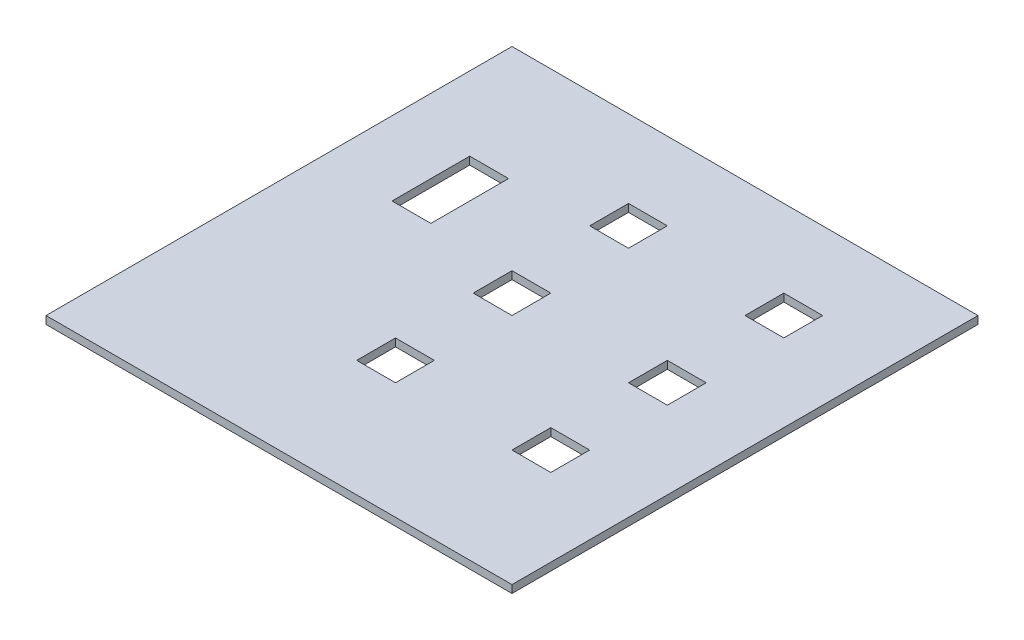
ISO-10303-21;
HEADER;
FILE_DESCRIPTION(('STEP AP214'),'2;1');
FILE_NAME('part.step','',(''),(''),'','','');
FILE_SCHEMA(('AUTOMOTIVE_DESIGN { 1 0 10303 214 1 1 1 1 }'));
ENDSEC;
DATA;
#1=APPLICATION_CONTEXT('core data for automotive mechanical design processes');
#2=APPLICATION_PROTOCOL_DEFINITION('international standard','automotive_design',2000,#1);
#3=PRODUCT_CONTEXT('',#1,'mechanical');
#4=PRODUCT('Part','Part','',(#3));
#5=PRODUCT_RELATED_PRODUCT_CATEGORY('part','',(#4));
#6=PRODUCT_DEFINITION_FORMATION('','',#4);
#7=PRODUCT_DEFINITION_CONTEXT('part definition',#1,'design');
#8=PRODUCT_DEFINITION('design','',#6,#7);
#9=PRODUCT_DEFINITION_SHAPE('','',#8);
#10=(LENGTH_UNIT() NAMED_UNIT(*) SI_UNIT(.MILLI.,.METRE.));
#11=(NAMED_UNIT(*) PLANE_ANGLE_UNIT() SI_UNIT($,.RADIAN.));
#12=(NAMED_UNIT(*) SI_UNIT($,.STERADIAN.) SOLID_ANGLE_UNIT());
#13=UNCERTAINTY_MEASURE_WITH_UNIT(LENGTH_MEASURE(1.E-05),#10,'distance_accuracy_value','');
#14=(GEOMETRIC_REPRESENTATION_CONTEXT(3) GLOBAL_UNCERTAINTY_ASSIGNED_CONTEXT((#13)) GLOBAL_UNIT_ASSIGNED_CONTEXT((#10,
#11,#12)) REPRESENTATION_CONTEXT('',''));
#15=CARTESIAN_POINT('',(0.,0.,0.));
#16=DIRECTION('',(0.,0.,1.));
#17=DIRECTION('',(1.,0.,0.));
#18=AXIS2_PLACEMENT_3D('',#15,#16,#17);
#19=CARTESIAN_POINT('',(76.2,0.,50.8));
#20=DIRECTION('',(0.,0.,-1.));
#21=DIRECTION('',(-1.,0.,0.));
#22=AXIS2_PLACEMENT_3D('',#19,#20,#21);
#23=PLANE('',#22);
#24=DIRECTION('',(-1.,0.,0.));
#25=VECTOR('',#24,1.);
#26=CARTESIAN_POINT('',(76.2,5.08,50.8));
#27=LINE('',#26,#25);
#28=CARTESIAN_POINT('',(101.6,5.08,50.8));
#29=VERTEX_POINT('',#28);
#30=CARTESIAN_POINT('',(76.2,5.08,50.8));
#31=VERTEX_POINT('',#30);
#32=EDGE_CURVE('E554',#29,#31,#27,.T.);
#33=ORIENTED_EDGE('',*,*,#32,.T.);
#34=DIRECTION('',(0.,1.,0.));
#35=VECTOR('',#34,1.);
#36=CARTESIAN_POINT('',(76.2,0.,50.8));
#37=LINE('',#36,#35);
#38=CARTESIAN_POINT('',(76.2,0.,50.8));
#39=VERTEX_POINT('',#38);
#40=EDGE_CURVE('E583',#39,#31,#37,.T.);
#41=ORIENTED_EDGE('',*,*,#40,.F.);
#42=DIRECTION('',(-1.,0.,0.));
#43=VECTOR('',#42,1.);
#44=CARTESIAN_POINT('',(76.2,0.,50.8));
#45=LINE('',#44,#43);
#46=CARTESIAN_POINT('',(101.6,0.,50.8));
#47=VERTEX_POINT('',#46);
#48=EDGE_CURVE('E561',#47,#39,#45,.T.);
#49=ORIENTED_EDGE('',*,*,#48,.F.);
#50=DIRECTION('',(0.,1.,0.));
#51=VECTOR('',#50,1.);
#52=CARTESIAN_POINT('',(101.6,0.,50.8));
#53=LINE('',#52,#51);
#54=EDGE_CURVE('E571',#47,#29,#53,.T.);
#55=ORIENTED_EDGE('',*,*,#54,.T.);
#56=EDGE_LOOP('',(#33,#41,#49,#55));
#57=FACE_BOUND('',#56,.T.);
#58=ADVANCED_FACE('F38',(#57),#23,.F.);
#59=CARTESIAN_POINT('',(76.2,0.,76.2));
#60=DIRECTION('',(-1.,0.,0.));
#61=DIRECTION('',(0.,0.,1.));
#62=AXIS2_PLACEMENT_3D('',#59,#60,#61);
#63=PLANE('',#62);
#64=DIRECTION('',(0.,0.,1.));
#65=VECTOR('',#64,1.);
#66=CARTESIAN_POINT('',(76.2,5.08,76.2));
#67=LINE('',#66,#65);
#68=CARTESIAN_POINT('',(76.2,5.08,76.2));
#69=VERTEX_POINT('',#68);
#70=EDGE_CURVE('E550',#31,#69,#67,.T.);
#71=ORIENTED_EDGE('',*,*,#70,.T.);
#72=DIRECTION('',(0.,1.,0.));
#73=VECTOR('',#72,1.);
#74=CARTESIAN_POINT('',(76.2,0.,76.2));
#75=LINE('',#74,#73);
#76=CARTESIAN_POINT('',(76.2,0.,76.2));
#77=VERTEX_POINT('',#76);
#78=EDGE_CURVE('E579',#77,#69,#75,.T.);
#79=ORIENTED_EDGE('',*,*,#78,.F.);
#80=DIRECTION('',(0.,0.,1.));
#81=VECTOR('',#80,1.);
#82=CARTESIAN_POINT('',(76.2,0.,76.2));
#83=LINE('',#82,#81);
#84=EDGE_CURVE('E564',#39,#77,#83,.T.);
#85=ORIENTED_EDGE('',*,*,#84,.F.);
#86=ORIENTED_EDGE('',*,*,#40,.T.);
#87=EDGE_LOOP('',(#71,#79,#85,#86));
#88=FACE_BOUND('',#87,.T.);
#89=ADVANCED_FACE('F615',(#88),#63,.F.);
#90=CARTESIAN_POINT('',(76.2,0.,76.2));
#91=DIRECTION('',(0.,0.,1.));
#92=DIRECTION('',(1.,0.,0.));
#93=AXIS2_PLACEMENT_3D('',#90,#91,#92);
#94=PLANE('',#93);
#95=DIRECTION('',(1.,0.,0.));
#96=VECTOR('',#95,1.);
#97=CARTESIAN_POINT('',(76.2,5.08,76.2));
#98=LINE('',#97,#96);
#99=CARTESIAN_POINT('',(101.6,5.08,76.2));
#100=VERTEX_POINT('',#99);
#101=EDGE_CURVE('E546',#69,#100,#98,.T.);
#102=ORIENTED_EDGE('',*,*,#101,.T.);
#103=DIRECTION('',(0.,1.,0.));
#104=VECTOR('',#103,1.);
#105=CARTESIAN_POINT('',(101.6,0.,76.2));
#106=LINE('',#105,#104);
#107=CARTESIAN_POINT('',(101.6,0.,76.2));
#108=VERTEX_POINT('',#107);
#109=EDGE_CURVE('E575',#108,#100,#106,.T.);
#110=ORIENTED_EDGE('',*,*,#109,.F.);
#111=DIRECTION('',(1.,0.,0.));
#112=VECTOR('',#111,1.);
#113=CARTESIAN_POINT('',(76.2,0.,76.2));
#114=LINE('',#113,#112);
#115=EDGE_CURVE('E567',#77,#108,#114,.T.);
#116=ORIENTED_EDGE('',*,*,#115,.F.);
#117=ORIENTED_EDGE('',*,*,#78,.T.);
#118=EDGE_LOOP('',(#102,#110,#116,#117));
#119=FACE_BOUND('',#118,.T.);
#120=ADVANCED_FACE('F621',(#119),#94,.F.);
#121=CARTESIAN_POINT('',(101.6,0.,76.2));
#122=DIRECTION('',(1.,0.,0.));
#123=DIRECTION('',(0.,0.,-1.));
#124=AXIS2_PLACEMENT_3D('',#121,#122,#123);
#125=PLANE('',#124);
#126=DIRECTION('',(0.,0.,-1.));
#127=VECTOR('',#126,1.);
#128=CARTESIAN_POINT('',(101.6,5.08,76.2));
#129=LINE('',#128,#127);
#130=EDGE_CURVE('E543',#100,#29,#129,.T.);
#131=ORIENTED_EDGE('',*,*,#130,.T.);
#132=ORIENTED_EDGE('',*,*,#54,.F.);
#133=DIRECTION('',(0.,0.,-1.));
#134=VECTOR('',#133,1.);
#135=CARTESIAN_POINT('',(101.6,0.,76.2));
#136=LINE('',#135,#134);
#137=EDGE_CURVE('E558',#108,#47,#136,.T.);
#138=ORIENTED_EDGE('',*,*,#137,.F.);
#139=ORIENTED_EDGE('',*,*,#109,.T.);
#140=EDGE_LOOP('',(#131,#132,#138,#139));
#141=FACE_BOUND('',#140,.T.);
#142=ADVANCED_FACE('F635',(#141),#125,.F.);
#143=CARTESIAN_POINT('',(76.2,0.,-25.4));
#144=DIRECTION('',(0.,0.,-1.));
#145=DIRECTION('',(-1.,0.,0.));
#146=AXIS2_PLACEMENT_3D('',#143,#144,#145);
#147=PLANE('',#146);
#148=DIRECTION('',(-1.,0.,0.));
#149=VECTOR('',#148,1.);
#150=CARTESIAN_POINT('',(76.2,5.08,-25.4));
#151=LINE('',#150,#149);
#152=CARTESIAN_POINT('',(101.6,5.08,-25.4));
#153=VERTEX_POINT('',#152);
#154=CARTESIAN_POINT('',(76.2,5.08,-25.4));
#155=VERTEX_POINT('',#154);
#156=EDGE_CURVE('E510',#153,#155,#151,.T.);
#157=ORIENTED_EDGE('',*,*,#156,.T.);
#158=DIRECTION('',(0.,1.,0.));
#159=VECTOR('',#158,1.);
#160=CARTESIAN_POINT('',(76.2,0.,-25.4));
#161=LINE('',#160,#159);
#162=CARTESIAN_POINT('',(76.2,0.,-25.4));
#163=VERTEX_POINT('',#162);
#164=EDGE_CURVE('E539',#163,#155,#161,.T.);
#165=ORIENTED_EDGE('',*,*,#164,.F.);
#166=DIRECTION('',(-1.,0.,0.));
#167=VECTOR('',#166,1.);
#168=CARTESIAN_POINT('',(76.2,0.,-25.4));
#169=LINE('',#168,#167);
#170=CARTESIAN_POINT('',(101.6,0.,-25.4));
#171=VERTEX_POINT('',#170);
#172=EDGE_CURVE('E517',#171,#163,#169,.T.);
#173=ORIENTED_EDGE('',*,*,#172,.F.);
#174=DIRECTION('',(0.,1.,0.));
#175=VECTOR('',#174,1.);
#176=CARTESIAN_POINT('',(101.6,0.,-25.4));
#177=LINE('',#176,#175);
#178=EDGE_CURVE('E527',#171,#153,#177,.T.);
#179=ORIENTED_EDGE('',*,*,#178,.T.);
#180=EDGE_LOOP('',(#157,#165,#173,#179));
#181=FACE_BOUND('',#180,.T.);
#182=ADVANCED_FACE('F706',(#181),#147,.F.);
#183=CARTESIAN_POINT('',(76.2,0.,0.));
#184=DIRECTION('',(-1.,0.,0.));
#185=DIRECTION('',(0.,0.,1.));
#186=AXIS2_PLACEMENT_3D('',#183,#184,#185);
#187=PLANE('',#186);
#188=DIRECTION('',(0.,0.,1.));
#189=VECTOR('',#188,1.);
#190=CARTESIAN_POINT('',(76.2,5.08,0.));
#191=LINE('',#190,#189);
#192=CARTESIAN_POINT('',(76.2,5.08,0.));
#193=VERTEX_POINT('',#192);
#194=EDGE_CURVE('E506',#155,#193,#191,.T.);
#195=ORIENTED_EDGE('',*,*,#194,.T.);
#196=DIRECTION('',(0.,1.,0.));
#197=VECTOR('',#196,1.);
#198=CARTESIAN_POINT('',(76.2,0.,0.));
#199=LINE('',#198,#197);
#200=CARTESIAN_POINT('',(76.2,0.,0.));
#201=VERTEX_POINT('',#200);
#202=EDGE_CURVE('E535',#201,#193,#199,.T.);
#203=ORIENTED_EDGE('',*,*,#202,.F.);
#204=DIRECTION('',(0.,0.,1.));
#205=VECTOR('',#204,1.);
#206=CARTESIAN_POINT('',(76.2,0.,0.));
#207=LINE('',#206,#205);
#208=EDGE_CURVE('E520',#163,#201,#207,.T.);
#209=ORIENTED_EDGE('',*,*,#208,.F.);
#210=ORIENTED_EDGE('',*,*,#164,.T.);
#211=EDGE_LOOP('',(#195,#203,#209,#210));
#212=FACE_BOUND('',#211,.T.);
#213=ADVANCED_FACE('F702',(#212),#187,.F.);
#214=CARTESIAN_POINT('',(76.2,0.,0.));
#215=DIRECTION('',(0.,0.,1.));
#216=DIRECTION('',(1.,0.,0.));
#217=AXIS2_PLACEMENT_3D('',#214,#215,#216);
#218=PLANE('',#217);
#219=DIRECTION('',(1.,0.,0.));
#220=VECTOR('',#219,1.);
#221=CARTESIAN_POINT('',(76.2,5.08,0.));
#222=LINE('',#221,#220);
#223=CARTESIAN_POINT('',(101.6,5.08,0.));
#224=VERTEX_POINT('',#223);
#225=EDGE_CURVE('E502',#193,#224,#222,.T.);
#226=ORIENTED_EDGE('',*,*,#225,.T.);
#227=DIRECTION('',(0.,1.,0.));
#228=VECTOR('',#227,1.);
#229=CARTESIAN_POINT('',(101.6,0.,0.));
#230=LINE('',#229,#228);
#231=CARTESIAN_POINT('',(101.6,0.,0.));
#232=VERTEX_POINT('',#231);
#233=EDGE_CURVE('E531',#232,#224,#230,.T.);
#234=ORIENTED_EDGE('',*,*,#233,.F.);
#235=DIRECTION('',(1.,0.,0.));
#236=VECTOR('',#235,1.);
#237=CARTESIAN_POINT('',(76.2,0.,0.));
#238=LINE('',#237,#236);
#239=EDGE_CURVE('E523',#201,#232,#238,.T.);
#240=ORIENTED_EDGE('',*,*,#239,.F.);
#241=ORIENTED_EDGE('',*,*,#202,.T.);
#242=EDGE_LOOP('',(#226,#234,#240,#241));
#243=FACE_BOUND('',#242,.T.);
#244=ADVANCED_FACE('F698',(#243),#218,.F.);
#245=CARTESIAN_POINT('',(101.6,0.,0.));
#246=DIRECTION('',(1.,0.,0.));
#247=DIRECTION('',(0.,0.,-1.));
#248=AXIS2_PLACEMENT_3D('',#245,#246,#247);
#249=PLANE('',#248);
#250=DIRECTION('',(0.,0.,-1.));
#251=VECTOR('',#250,1.);
#252=CARTESIAN_POINT('',(101.6,5.08,0.));
#253=LINE('',#252,#251);
#254=EDGE_CURVE('E499',#224,#153,#253,.T.);
#255=ORIENTED_EDGE('',*,*,#254,.T.);
#256=ORIENTED_EDGE('',*,*,#178,.F.);
#257=DIRECTION('',(0.,0.,-1.));
#258=VECTOR('',#257,1.);
#259=CARTESIAN_POINT('',(101.6,0.,0.));
#260=LINE('',#259,#258);
#261=EDGE_CURVE('E514',#232,#171,#260,.T.);
#262=ORIENTED_EDGE('',*,*,#261,.F.);
#263=ORIENTED_EDGE('',*,*,#233,.T.);
#264=EDGE_LOOP('',(#255,#256,#262,#263));
#265=FACE_BOUND('',#264,.T.);
#266=ADVANCED_FACE('F694',(#265),#249,.F.);
#267=CARTESIAN_POINT('',(76.2,0.,-101.6));
#268=DIRECTION('',(0.,0.,-1.));
#269=DIRECTION('',(-1.,0.,0.));
#270=AXIS2_PLACEMENT_3D('',#267,#268,#269);
#271=PLANE('',#270);
#272=DIRECTION('',(-1.,0.,0.));
#273=VECTOR('',#272,1.);
#274=CARTESIAN_POINT('',(76.2,5.08,-101.6));
#275=LINE('',#274,#273);
#276=CARTESIAN_POINT('',(101.6,5.08,-101.6));
#277=VERTEX_POINT('',#276);
#278=CARTESIAN_POINT('',(76.2,5.08,-101.6));
#279=VERTEX_POINT('',#278);
#280=EDGE_CURVE('E466',#277,#279,#275,.T.);
#281=ORIENTED_EDGE('',*,*,#280,.T.);
#282=DIRECTION('',(0.,1.,0.));
#283=VECTOR('',#282,1.);
#284=CARTESIAN_POINT('',(76.2,0.,-101.6));
#285=LINE('',#284,#283);
#286=CARTESIAN_POINT('',(76.2,0.,-101.6));
#287=VERTEX_POINT('',#286);
#288=EDGE_CURVE('E495',#287,#279,#285,.T.);
#289=ORIENTED_EDGE('',*,*,#288,.F.);
#290=DIRECTION('',(-1.,0.,0.));
#291=VECTOR('',#290,1.);
#292=CARTESIAN_POINT('',(76.2,0.,-101.6));
#293=LINE('',#292,#291);
#294=CARTESIAN_POINT('',(101.6,0.,-101.6));
#295=VERTEX_POINT('',#294);
#296=EDGE_CURVE('E473',#295,#287,#293,.T.);
#297=ORIENTED_EDGE('',*,*,#296,.F.);
#298=DIRECTION('',(0.,1.,0.));
#299=VECTOR('',#298,1.);
#300=CARTESIAN_POINT('',(101.6,0.,-101.6));
#301=LINE('',#300,#299);
#302=EDGE_CURVE('E483',#295,#277,#301,.T.);
#303=ORIENTED_EDGE('',*,*,#302,.T.);
#304=EDGE_LOOP('',(#281,#289,#297,#303));
#305=FACE_BOUND('',#304,.T.);
#306=ADVANCED_FACE('F690',(#305),#271,.F.);
#307=CARTESIAN_POINT('',(76.2,0.,-76.2));
#308=DIRECTION('',(-1.,0.,0.));
#309=DIRECTION('',(0.,0.,1.));
#310=AXIS2_PLACEMENT_3D('',#307,#308,#309);
#311=PLANE('',#310);
#312=DIRECTION('',(0.,0.,1.));
#313=VECTOR('',#312,1.);
#314=CARTESIAN_POINT('',(76.2,5.08,-76.2));
#315=LINE('',#314,#313);
#316=CARTESIAN_POINT('',(76.2,5.08,-76.2));
#317=VERTEX_POINT('',#316);
#318=EDGE_CURVE('E462',#279,#317,#315,.T.);
#319=ORIENTED_EDGE('',*,*,#318,.T.);
#320=DIRECTION('',(0.,1.,0.));
#321=VECTOR('',#320,1.);
#322=CARTESIAN_POINT('',(76.2,0.,-76.2));
#323=LINE('',#322,#321);
#324=CARTESIAN_POINT('',(76.2,0.,-76.2));
#325=VERTEX_POINT('',#324);
#326=EDGE_CURVE('E491',#325,#317,#323,.T.);
#327=ORIENTED_EDGE('',*,*,#326,.F.);
#328=DIRECTION('',(0.,0.,1.));
#329=VECTOR('',#328,1.);
#330=CARTESIAN_POINT('',(76.2,0.,-76.2));
#331=LINE('',#330,#329);
#332=EDGE_CURVE('E476',#287,#325,#331,.T.);
#333=ORIENTED_EDGE('',*,*,#332,.F.);
#334=ORIENTED_EDGE('',*,*,#288,.T.);
#335=EDGE_LOOP('',(#319,#327,#333,#334));
#336=FACE_BOUND('',#335,.T.);
#337=ADVANCED_FACE('F686',(#336),#311,.F.);
#338=CARTESIAN_POINT('',(76.2,0.,-76.2));
#339=DIRECTION('',(0.,0.,1.));
#340=DIRECTION('',(1.,0.,0.));
#341=AXIS2_PLACEMENT_3D('',#338,#339,#340);
#342=PLANE('',#341);
#343=DIRECTION('',(1.,0.,0.));
#344=VECTOR('',#343,1.);
#345=CARTESIAN_POINT('',(76.2,5.08,-76.2));
#346=LINE('',#345,#344);
#347=CARTESIAN_POINT('',(101.6,5.08,-76.2));
#348=VERTEX_POINT('',#347);
#349=EDGE_CURVE('E458',#317,#348,#346,.T.);
#350=ORIENTED_EDGE('',*,*,#349,.T.);
#351=DIRECTION('',(0.,1.,0.));
#352=VECTOR('',#351,1.);
#353=CARTESIAN_POINT('',(101.6,0.,-76.2));
#354=LINE('',#353,#352);
#355=CARTESIAN_POINT('',(101.6,0.,-76.2));
#356=VERTEX_POINT('',#355);
#357=EDGE_CURVE('E487',#356,#348,#354,.T.);
#358=ORIENTED_EDGE('',*,*,#357,.F.);
#359=DIRECTION('',(1.,0.,0.));
#360=VECTOR('',#359,1.);
#361=CARTESIAN_POINT('',(76.2,0.,-76.2));
#362=LINE('',#361,#360);
#363=EDGE_CURVE('E479',#325,#356,#362,.T.);
#364=ORIENTED_EDGE('',*,*,#363,.F.);
#365=ORIENTED_EDGE('',*,*,#326,.T.);
#366=EDGE_LOOP('',(#350,#358,#364,#365));
#367=FACE_BOUND('',#366,.T.);
#368=ADVANCED_FACE('F682',(#367),#342,.F.);
#369=CARTESIAN_POINT('',(101.6,0.,-76.2));
#370=DIRECTION('',(1.,0.,0.));
#371=DIRECTION('',(0.,0.,-1.));
#372=AXIS2_PLACEMENT_3D('',#369,#370,#371);
#373=PLANE('',#372);
#374=DIRECTION('',(0.,0.,-1.));
#375=VECTOR('',#374,1.);
#376=CARTESIAN_POINT('',(101.6,5.08,-76.2));
#377=LINE('',#376,#375);
#378=EDGE_CURVE('E455',#348,#277,#377,.T.);
#379=ORIENTED_EDGE('',*,*,#378,.T.);
#380=ORIENTED_EDGE('',*,*,#302,.F.);
#381=DIRECTION('',(0.,0.,-1.));
#382=VECTOR('',#381,1.);
#383=CARTESIAN_POINT('',(101.6,0.,-76.2));
#384=LINE('',#383,#382);
#385=EDGE_CURVE('E470',#356,#295,#384,.T.);
#386=ORIENTED_EDGE('',*,*,#385,.F.);
#387=ORIENTED_EDGE('',*,*,#357,.T.);
#388=EDGE_LOOP('',(#379,#380,#386,#387));
#389=FACE_BOUND('',#388,.T.);
#390=ADVANCED_FACE('F678',(#389),#373,.F.);
#391=CARTESIAN_POINT('',(-25.4,0.,50.8));
#392=DIRECTION('',(0.,0.,-1.));
#393=DIRECTION('',(-1.,0.,0.));
#394=AXIS2_PLACEMENT_3D('',#391,#392,#393);
#395=PLANE('',#394);
#396=DIRECTION('',(-1.,0.,0.));
#397=VECTOR('',#396,1.);
#398=CARTESIAN_POINT('',(-25.4,5.08,50.8));
#399=LINE('',#398,#397);
#400=CARTESIAN_POINT('',(0.,5.08,50.8));
#401=VERTEX_POINT('',#400);
#402=CARTESIAN_POINT('',(-25.4,5.08,50.8));
#403=VERTEX_POINT('',#402);
#404=EDGE_CURVE('E422',#401,#403,#399,.T.);
#405=ORIENTED_EDGE('',*,*,#404,.T.);
#406=DIRECTION('',(0.,1.,0.));
#407=VECTOR('',#406,1.);
#408=CARTESIAN_POINT('',(-25.4,0.,50.8));
#409=LINE('',#408,#407);
#410=CARTESIAN_POINT('',(-25.4,0.,50.8));
#411=VERTEX_POINT('',#410);
#412=EDGE_CURVE('E451',#411,#403,#409,.T.);
#413=ORIENTED_EDGE('',*,*,#412,.F.);
#414=DIRECTION('',(-1.,0.,0.));
#415=VECTOR('',#414,1.);
#416=CARTESIAN_POINT('',(-25.4,0.,50.8));
#417=LINE('',#416,#415);
#418=CARTESIAN_POINT('',(0.,0.,50.8));
#419=VERTEX_POINT('',#418);
#420=EDGE_CURVE('E429',#419,#411,#417,.T.);
#421=ORIENTED_EDGE('',*,*,#420,.F.);
#422=DIRECTION('',(0.,1.,0.));
#423=VECTOR('',#422,1.);
#424=CARTESIAN_POINT('',(0.,0.,50.8));
#425=LINE('',#424,#423);
#426=EDGE_CURVE('E439',#419,#401,#425,.T.);
#427=ORIENTED_EDGE('',*,*,#426,.T.);
#428=EDGE_LOOP('',(#405,#413,#421,#427));
#429=FACE_BOUND('',#428,.T.);
#430=ADVANCED_FACE('F674',(#429),#395,.F.);
#431=CARTESIAN_POINT('',(-25.4,0.,76.2));
#432=DIRECTION('',(-1.,0.,0.));
#433=DIRECTION('',(0.,0.,1.));
#434=AXIS2_PLACEMENT_3D('',#431,#432,#433);
#435=PLANE('',#434);
#436=DIRECTION('',(0.,0.,1.));
#437=VECTOR('',#436,1.);
#438=CARTESIAN_POINT('',(-25.4,5.08,76.2));
#439=LINE('',#438,#437);
#440=CARTESIAN_POINT('',(-25.4,5.08,76.2));
#441=VERTEX_POINT('',#440);
#442=EDGE_CURVE('E418',#403,#441,#439,.T.);
#443=ORIENTED_EDGE('',*,*,#442,.T.);
#444=DIRECTION('',(0.,1.,0.));
#445=VECTOR('',#444,1.);
#446=CARTESIAN_POINT('',(-25.4,0.,76.2));
#447=LINE('',#446,#445);
#448=CARTESIAN_POINT('',(-25.4,0.,76.2));
#449=VERTEX_POINT('',#448);
#450=EDGE_CURVE('E447',#449,#441,#447,.T.);
#451=ORIENTED_EDGE('',*,*,#450,.F.);
#452=DIRECTION('',(0.,0.,1.));
#453=VECTOR('',#452,1.);
#454=CARTESIAN_POINT('',(-25.4,0.,76.2));
#455=LINE('',#454,#453);
#456=EDGE_CURVE('E432',#411,#449,#455,.T.);
#457=ORIENTED_EDGE('',*,*,#456,.F.);
#458=ORIENTED_EDGE('',*,*,#412,.T.);
#459=EDGE_LOOP('',(#443,#451,#457,#458));
#460=FACE_BOUND('',#459,.T.);
#461=ADVANCED_FACE('F670',(#460),#435,.F.);
#462=CARTESIAN_POINT('',(-25.4,0.,76.2));
#463=DIRECTION('',(0.,0.,1.));
#464=DIRECTION('',(1.,0.,0.));
#465=AXIS2_PLACEMENT_3D('',#462,#463,#464);
#466=PLANE('',#465);
#467=DIRECTION('',(1.,0.,0.));
#468=VECTOR('',#467,1.);
#469=CARTESIAN_POINT('',(-25.4,5.08,76.2));
#470=LINE('',#469,#468);
#471=CARTESIAN_POINT('',(0.,5.08,76.2));
#472=VERTEX_POINT('',#471);
#473=EDGE_CURVE('E414',#441,#472,#470,.T.);
#474=ORIENTED_EDGE('',*,*,#473,.T.);
#475=DIRECTION('',(0.,1.,0.));
#476=VECTOR('',#475,1.);
#477=CARTESIAN_POINT('',(0.,0.,76.2));
#478=LINE('',#477,#476);
#479=CARTESIAN_POINT('',(0.,0.,76.2));
#480=VERTEX_POINT('',#479);
#481=EDGE_CURVE('E443',#480,#472,#478,.T.);
#482=ORIENTED_EDGE('',*,*,#481,.F.);
#483=DIRECTION('',(1.,0.,0.));
#484=VECTOR('',#483,1.);
#485=CARTESIAN_POINT('',(-25.4,0.,76.2));
#486=LINE('',#485,#484);
#487=EDGE_CURVE('E435',#449,#480,#486,.T.);
#488=ORIENTED_EDGE('',*,*,#487,.F.);
#489=ORIENTED_EDGE('',*,*,#450,.T.);
#490=EDGE_LOOP('',(#474,#482,#488,#489));
#491=FACE_BOUND('',#490,.T.);
#492=ADVANCED_FACE('F666',(#491),#466,.F.);
#493=CARTESIAN_POINT('',(0.,0.,76.2));
#494=DIRECTION('',(1.,0.,0.));
#495=DIRECTION('',(0.,0.,-1.));
#496=AXIS2_PLACEMENT_3D('',#493,#494,#495);
#497=PLANE('',#496);
#498=DIRECTION('',(0.,0.,-1.));
#499=VECTOR('',#498,1.);
#500=CARTESIAN_POINT('',(0.,5.08,76.2));
#501=LINE('',#500,#499);
#502=EDGE_CURVE('E411',#472,#401,#501,.T.);
#503=ORIENTED_EDGE('',*,*,#502,.T.);
#504=ORIENTED_EDGE('',*,*,#426,.F.);
#505=DIRECTION('',(0.,0.,-1.));
#506=VECTOR('',#505,1.);
#507=CARTESIAN_POINT('',(0.,0.,76.2));
#508=LINE('',#507,#506);
#509=EDGE_CURVE('E426',#480,#419,#508,.T.);
#510=ORIENTED_EDGE('',*,*,#509,.F.);
#511=ORIENTED_EDGE('',*,*,#481,.T.);
#512=EDGE_LOOP('',(#503,#504,#510,#511));
#513=FACE_BOUND('',#512,.T.);
#514=ADVANCED_FACE('F662',(#513),#497,.F.);
#515=CARTESIAN_POINT('',(152.4,5.08,152.4));
#516=DIRECTION('',(-1.,0.,0.));
#517=DIRECTION('',(0.,0.,1.));
#518=AXIS2_PLACEMENT_3D('',#515,#516,#517);
#519=PLANE('',#518);
#520=DIRECTION('',(0.,0.,-1.));
#521=VECTOR('',#520,1.);
#522=CARTESIAN_POINT('',(152.4,0.,152.4));
#523=LINE('',#522,#521);
#524=CARTESIAN_POINT('',(152.4,0.,152.4));
#525=VERTEX_POINT('',#524);
#526=CARTESIAN_POINT('',(152.4,0.,-152.4));
#527=VERTEX_POINT('',#526);
#528=EDGE_CURVE('E360',#525,#527,#523,.T.);
#529=ORIENTED_EDGE('',*,*,#528,.T.);
#530=DIRECTION('',(0.,-1.,0.));
#531=VECTOR('',#530,1.);
#532=CARTESIAN_POINT('',(152.4,5.08,-152.4));
#533=LINE('',#532,#531);
#534=CARTESIAN_POINT('',(152.4,5.08,-152.4));
#535=VERTEX_POINT('',#534);
#536=EDGE_CURVE('E407',#535,#527,#533,.T.);
#537=ORIENTED_EDGE('',*,*,#536,.F.);
#538=DIRECTION('',(0.,0.,-1.));
#539=VECTOR('',#538,1.);
#540=CARTESIAN_POINT('',(152.4,5.08,152.4));
#541=LINE('',#540,#539);
#542=CARTESIAN_POINT('',(152.4,5.08,152.4));
#543=VERTEX_POINT('',#542);
#544=EDGE_CURVE('E370',#543,#535,#541,.T.);
#545=ORIENTED_EDGE('',*,*,#544,.F.);
#546=DIRECTION('',(0.,-1.,0.));
#547=VECTOR('',#546,1.);
#548=CARTESIAN_POINT('',(152.4,5.08,152.4));
#549=LINE('',#548,#547);
#550=EDGE_CURVE('E384',#543,#525,#549,.T.);
#551=ORIENTED_EDGE('',*,*,#550,.T.);
#552=EDGE_LOOP('',(#529,#537,#545,#551));
#553=FACE_BOUND('',#552,.T.);
#554=ADVANCED_FACE('F658',(#553),#519,.F.);
#555=CARTESIAN_POINT('',(-152.4,5.08,-152.4));
#556=DIRECTION('',(0.,0.,1.));
#557=DIRECTION('',(1.,0.,0.));
#558=AXIS2_PLACEMENT_3D('',#555,#556,#557);
#559=PLANE('',#558);
#560=DIRECTION('',(-1.,0.,0.));
#561=VECTOR('',#560,1.);
#562=CARTESIAN_POINT('',(-152.4,0.,-152.4));
#563=LINE('',#562,#561);
#564=CARTESIAN_POINT('',(-152.4,0.,-152.4));
#565=VERTEX_POINT('',#564);
#566=EDGE_CURVE('E388',#527,#565,#563,.T.);
#567=ORIENTED_EDGE('',*,*,#566,.T.);
#568=DIRECTION('',(0.,-1.,0.));
#569=VECTOR('',#568,1.);
#570=CARTESIAN_POINT('',(-152.4,5.08,-152.4));
#571=LINE('',#570,#569);
#572=CARTESIAN_POINT('',(-152.4,5.08,-152.4));
#573=VERTEX_POINT('',#572);
#574=EDGE_CURVE('E403',#573,#565,#571,.T.);
#575=ORIENTED_EDGE('',*,*,#574,.F.);
#576=DIRECTION('',(-1.,0.,0.));
#577=VECTOR('',#576,1.);
#578=CARTESIAN_POINT('',(-152.4,5.08,-152.4));
#579=LINE('',#578,#577);
#580=EDGE_CURVE('E374',#535,#573,#579,.T.);
#581=ORIENTED_EDGE('',*,*,#580,.F.);
#582=ORIENTED_EDGE('',*,*,#536,.T.);
#583=EDGE_LOOP('',(#567,#575,#581,#582));
#584=FACE_BOUND('',#583,.T.);
#585=ADVANCED_FACE('F654',(#584),#559,.F.);
#586=CARTESIAN_POINT('',(-152.4,5.08,152.4));
#587=DIRECTION('',(1.,0.,0.));
#588=DIRECTION('',(0.,0.,-1.));
#589=AXIS2_PLACEMENT_3D('',#586,#587,#588);
#590=PLANE('',#589);
#591=DIRECTION('',(0.,0.,1.));
#592=VECTOR('',#591,1.);
#593=CARTESIAN_POINT('',(-152.4,0.,152.4));
#594=LINE('',#593,#592);
#595=CARTESIAN_POINT('',(-152.4,0.,152.4));
#596=VERTEX_POINT('',#595);
#597=EDGE_CURVE('E391',#565,#596,#594,.T.);
#598=ORIENTED_EDGE('',*,*,#597,.T.);
#599=DIRECTION('',(0.,-1.,0.));
#600=VECTOR('',#599,1.);
#601=CARTESIAN_POINT('',(-152.4,5.08,152.4));
#602=LINE('',#601,#600);
#603=CARTESIAN_POINT('',(-152.4,5.08,152.4));
#604=VERTEX_POINT('',#603);
#605=EDGE_CURVE('E399',#604,#596,#602,.T.);
#606=ORIENTED_EDGE('',*,*,#605,.F.);
#607=DIRECTION('',(0.,0.,1.));
#608=VECTOR('',#607,1.);
#609=CARTESIAN_POINT('',(-152.4,5.08,152.4));
#610=LINE('',#609,#608);
#611=EDGE_CURVE('E378',#573,#604,#610,.T.);
#612=ORIENTED_EDGE('',*,*,#611,.F.);
#613=ORIENTED_EDGE('',*,*,#574,.T.);
#614=EDGE_LOOP('',(#598,#606,#612,#613));
#615=FACE_BOUND('',#614,.T.);
#616=ADVANCED_FACE('F646',(#615),#590,.F.);
#617=CARTESIAN_POINT('',(-152.4,5.08,152.4));
#618=DIRECTION('',(0.,0.,-1.));
#619=DIRECTION('',(-1.,0.,0.));
#620=AXIS2_PLACEMENT_3D('',#617,#618,#619);
#621=PLANE('',#620);
#622=DIRECTION('',(1.,0.,0.));
#623=VECTOR('',#622,1.);
#624=CARTESIAN_POINT('',(-152.4,0.,152.4));
#625=LINE('',#624,#623);
#626=EDGE_CURVE('E375',#596,#525,#625,.T.);
#627=ORIENTED_EDGE('',*,*,#626,.T.);
#628=ORIENTED_EDGE('',*,*,#550,.F.);
#629=DIRECTION('',(1.,0.,0.));
#630=VECTOR('',#629,1.);
#631=CARTESIAN_POINT('',(-152.4,5.08,152.4));
#632=LINE('',#631,#630);
#633=EDGE_CURVE('E381',#604,#543,#632,.T.);
#634=ORIENTED_EDGE('',*,*,#633,.F.);
#635=ORIENTED_EDGE('',*,*,#605,.T.);
#636=EDGE_LOOP('',(#627,#628,#634,#635));
#637=FACE_BOUND('',#636,.T.);
#638=ADVANCED_FACE('F637',(#637),#621,.F.);
#639=CARTESIAN_POINT('',(0.,5.08,0.));
#640=DIRECTION('',(0.,-1.,0.));
#641=DIRECTION('',(0.,0.,-1.));
#642=AXIS2_PLACEMENT_3D('',#639,#640,#641);
#643=PLANE('',#642);
#644=DIRECTION('',(-1.,0.,0.));
#645=VECTOR('',#644,1.);
#646=CARTESIAN_POINT('',(-104.107513772904,5.08,-76.449523056669));
#647=LINE('',#646,#645);
#648=CARTESIAN_POINT('',(-78.7075137729036,5.08,-76.449523056669));
#649=VERTEX_POINT('',#648);
#650=CARTESIAN_POINT('',(-104.107513772904,5.08,-76.449523056669));
#651=VERTEX_POINT('',#650);
#652=EDGE_CURVE('E259',#649,#651,#647,.T.);
#653=ORIENTED_EDGE('',*,*,#652,.F.);
#654=DIRECTION('',(0.,0.,-1.));
#655=VECTOR('',#654,1.);
#656=CARTESIAN_POINT('',(-78.7075137729036,5.08,-25.649523056669));
#657=LINE('',#656,#655);
#658=CARTESIAN_POINT('',(-78.7075137729036,5.08,-25.649523056669));
#659=VERTEX_POINT('',#658);
#660=EDGE_CURVE('E53',#659,#649,#657,.T.);
#661=ORIENTED_EDGE('',*,*,#660,.F.);
#662=DIRECTION('',(1.,0.,0.));
#663=VECTOR('',#662,1.);
#664=CARTESIAN_POINT('',(-104.107513772904,5.08,-25.649523056669));
#665=LINE('',#664,#663);
#666=CARTESIAN_POINT('',(-104.107513772904,5.08,-25.649523056669));
#667=VERTEX_POINT('',#666);
#668=EDGE_CURVE('E267',#667,#659,#665,.T.);
#669=ORIENTED_EDGE('',*,*,#668,.F.);
#670=DIRECTION('',(0.,0.,1.));
#671=VECTOR('',#670,1.);
#672=CARTESIAN_POINT('',(-104.107513772904,5.08,-25.649523056669));
#673=LINE('',#672,#671);
#674=EDGE_CURVE('E249',#651,#667,#673,.T.);
#675=ORIENTED_EDGE('',*,*,#674,.F.);
#676=EDGE_LOOP('',(#653,#661,#669,#675));
#677=FACE_BOUND('',#676,.T.);
#678=DIRECTION('',(-1.,0.,0.));
#679=VECTOR('',#678,1.);
#680=CARTESIAN_POINT('',(-25.4,5.08,-25.4));
#681=LINE('',#680,#679);
#682=CARTESIAN_POINT('',(0.,5.08,-25.4));
#683=VERTEX_POINT('',#682);
#684=CARTESIAN_POINT('',(-25.4,5.08,-25.4));
#685=VERTEX_POINT('',#684);
#686=EDGE_CURVE('E277',#683,#685,#681,.T.);
#687=ORIENTED_EDGE('',*,*,#686,.F.);
#688=DIRECTION('',(0.,0.,-1.));
#689=VECTOR('',#688,1.);
#690=CARTESIAN_POINT('',(0.,5.08,0.));
#691=LINE('',#690,#689);
#692=CARTESIAN_POINT('',(0.,5.08,0.));
#693=VERTEX_POINT('',#692);
#694=EDGE_CURVE('E318',#693,#683,#691,.T.);
#695=ORIENTED_EDGE('',*,*,#694,.F.);
#696=DIRECTION('',(1.,0.,0.));
#697=VECTOR('',#696,1.);
#698=CARTESIAN_POINT('',(-25.4,5.08,0.));
#699=LINE('',#698,#697);
#700=CARTESIAN_POINT('',(-25.4,5.08,0.));
#701=VERTEX_POINT('',#700);
#702=EDGE_CURVE('E307',#701,#693,#699,.T.);
#703=ORIENTED_EDGE('',*,*,#702,.F.);
#704=DIRECTION('',(0.,0.,1.));
#705=VECTOR('',#704,1.);
#706=CARTESIAN_POINT('',(-25.4,5.08,0.));
#707=LINE('',#706,#705);
#708=EDGE_CURVE('E296',#685,#701,#707,.T.);
#709=ORIENTED_EDGE('',*,*,#708,.F.);
#710=EDGE_LOOP('',(#687,#695,#703,#709));
#711=FACE_BOUND('',#710,.T.);
#712=DIRECTION('',(-1.,0.,0.));
#713=VECTOR('',#712,1.);
#714=CARTESIAN_POINT('',(-25.4,5.08,-101.6));
#715=LINE('',#714,#713);
#716=CARTESIAN_POINT('',(0.,5.08,-101.6));
#717=VERTEX_POINT('',#716);
#718=CARTESIAN_POINT('',(-25.4,5.08,-101.6));
#719=VERTEX_POINT('',#718);
#720=EDGE_CURVE('E346',#717,#719,#715,.T.);
#721=ORIENTED_EDGE('',*,*,#720,.F.);
#722=DIRECTION('',(0.,0.,-1.));
#723=VECTOR('',#722,1.);
#724=CARTESIAN_POINT('',(0.,5.08,-76.2));
#725=LINE('',#724,#723);
#726=CARTESIAN_POINT('',(0.,5.08,-76.2));
#727=VERTEX_POINT('',#726);
#728=EDGE_CURVE('E325',#727,#717,#725,.T.);
#729=ORIENTED_EDGE('',*,*,#728,.F.);
#730=DIRECTION('',(1.,0.,0.));
#731=VECTOR('',#730,1.);
#732=CARTESIAN_POINT('',(-25.4,5.08,-76.2));
#733=LINE('',#732,#731);
#734=CARTESIAN_POINT('',(-25.4,5.08,-76.2));
#735=VERTEX_POINT('',#734);
#736=EDGE_CURVE('E331',#735,#727,#733,.T.);
#737=ORIENTED_EDGE('',*,*,#736,.F.);
#738=DIRECTION('',(0.,0.,1.));
#739=VECTOR('',#738,1.);
#740=CARTESIAN_POINT('',(-25.4,5.08,-76.2));
#741=LINE('',#740,#739);
#742=EDGE_CURVE('E350',#719,#735,#741,.T.);
#743=ORIENTED_EDGE('',*,*,#742,.F.);
#744=EDGE_LOOP('',(#721,#729,#737,#743));
#745=FACE_BOUND('',#744,.T.);
#746=ORIENTED_EDGE('',*,*,#544,.T.);
#747=ORIENTED_EDGE('',*,*,#580,.T.);
#748=ORIENTED_EDGE('',*,*,#611,.T.);
#749=ORIENTED_EDGE('',*,*,#633,.T.);
#750=EDGE_LOOP('',(#746,#747,#748,#749));
#751=FACE_BOUND('',#750,.T.);
#752=ORIENTED_EDGE('',*,*,#502,.F.);
#753=ORIENTED_EDGE('',*,*,#473,.F.);
#754=ORIENTED_EDGE('',*,*,#442,.F.);
#755=ORIENTED_EDGE('',*,*,#404,.F.);
#756=EDGE_LOOP('',(#752,#753,#754,#755));
#757=FACE_BOUND('',#756,.T.);
#758=ORIENTED_EDGE('',*,*,#378,.F.);
#759=ORIENTED_EDGE('',*,*,#349,.F.);
#760=ORIENTED_EDGE('',*,*,#318,.F.);
#761=ORIENTED_EDGE('',*,*,#280,.F.);
#762=EDGE_LOOP('',(#758,#759,#760,#761));
#763=FACE_BOUND('',#762,.T.);
#764=ORIENTED_EDGE('',*,*,#254,.F.);
#765=ORIENTED_EDGE('',*,*,#225,.F.);
#766=ORIENTED_EDGE('',*,*,#194,.F.);
#767=ORIENTED_EDGE('',*,*,#156,.F.);
#768=EDGE_LOOP('',(#764,#765,#766,#767));
#769=FACE_BOUND('',#768,.T.);
#770=ORIENTED_EDGE('',*,*,#130,.F.);
#771=ORIENTED_EDGE('',*,*,#101,.F.);
#772=ORIENTED_EDGE('',*,*,#70,.F.);
#773=ORIENTED_EDGE('',*,*,#32,.F.);
#774=EDGE_LOOP('',(#770,#771,#772,#773));
#775=FACE_BOUND('',#774,.T.);
#776=ADVANCED_FACE('F264',(#677,#711,#745,#751,#757,#763,#769,#775),#643,.F.);
#777=CARTESIAN_POINT('',(0.,0.,0.));
#778=DIRECTION('',(0.,-1.,0.));
#779=DIRECTION('',(0.,0.,-1.));
#780=AXIS2_PLACEMENT_3D('',#777,#778,#779);
#781=PLANE('',#780);
#782=DIRECTION('',(0.,0.,1.));
#783=VECTOR('',#782,1.);
#784=CARTESIAN_POINT('',(-78.7075137729036,0.,0.));
#785=LINE('',#784,#783);
#786=CARTESIAN_POINT('',(-78.7075137729036,0.,-76.449523056669));
#787=VERTEX_POINT('',#786);
#788=CARTESIAN_POINT('',(-78.7075137729036,0.,-25.649523056669));
#789=VERTEX_POINT('',#788);
#790=EDGE_CURVE('E11',#787,#789,#785,.T.);
#791=ORIENTED_EDGE('',*,*,#790,.F.);
#792=DIRECTION('',(1.,0.,0.));
#793=VECTOR('',#792,1.);
#794=CARTESIAN_POINT('',(0.,0.,-76.449523056669));
#795=LINE('',#794,#793);
#796=CARTESIAN_POINT('',(-104.107513772904,0.,-76.449523056669));
#797=VERTEX_POINT('',#796);
#798=EDGE_CURVE('E587',#797,#787,#795,.T.);
#799=ORIENTED_EDGE('',*,*,#798,.F.);
#800=DIRECTION('',(0.,0.,-1.));
#801=VECTOR('',#800,1.);
#802=CARTESIAN_POINT('',(-104.107513772904,0.,0.));
#803=LINE('',#802,#801);
#804=CARTESIAN_POINT('',(-104.107513772904,0.,-25.649523056669));
#805=VERTEX_POINT('',#804);
#806=EDGE_CURVE('E252',#805,#797,#803,.T.);
#807=ORIENTED_EDGE('',*,*,#806,.F.);
#808=DIRECTION('',(-1.,0.,0.));
#809=VECTOR('',#808,1.);
#810=CARTESIAN_POINT('',(0.,0.,-25.649523056669));
#811=LINE('',#810,#809);
#812=EDGE_CURVE('E46',#789,#805,#811,.T.);
#813=ORIENTED_EDGE('',*,*,#812,.F.);
#814=EDGE_LOOP('',(#791,#799,#807,#813));
#815=FACE_BOUND('',#814,.T.);
#816=DIRECTION('',(0.,0.,-1.));
#817=VECTOR('',#816,1.);
#818=CARTESIAN_POINT('',(0.,0.,0.));
#819=LINE('',#818,#817);
#820=CARTESIAN_POINT('',(0.,0.,0.));
#821=VERTEX_POINT('',#820);
#822=CARTESIAN_POINT('',(0.,0.,-25.4));
#823=VERTEX_POINT('',#822);
#824=EDGE_CURVE('E321',#821,#823,#819,.T.);
#825=ORIENTED_EDGE('',*,*,#824,.T.);
#826=DIRECTION('',(-1.,0.,0.));
#827=VECTOR('',#826,1.);
#828=CARTESIAN_POINT('',(-25.4,0.,-25.4));
#829=LINE('',#828,#827);
#830=CARTESIAN_POINT('',(-25.4,0.,-25.4));
#831=VERTEX_POINT('',#830);
#832=EDGE_CURVE('E284',#823,#831,#829,.T.);
#833=ORIENTED_EDGE('',*,*,#832,.T.);
#834=DIRECTION('',(0.,0.,1.));
#835=VECTOR('',#834,1.);
#836=CARTESIAN_POINT('',(-25.4,0.,0.));
#837=LINE('',#836,#835);
#838=CARTESIAN_POINT('',(-25.4,0.,0.));
#839=VERTEX_POINT('',#838);
#840=EDGE_CURVE('E303',#831,#839,#837,.T.);
#841=ORIENTED_EDGE('',*,*,#840,.T.);
#842=DIRECTION('',(1.,0.,0.));
#843=VECTOR('',#842,1.);
#844=CARTESIAN_POINT('',(-25.4,0.,0.));
#845=LINE('',#844,#843);
#846=EDGE_CURVE('E314',#839,#821,#845,.T.);
#847=ORIENTED_EDGE('',*,*,#846,.T.);
#848=EDGE_LOOP('',(#825,#833,#841,#847));
#849=FACE_BOUND('',#848,.T.);
#850=DIRECTION('',(0.,0.,-1.));
#851=VECTOR('',#850,1.);
#852=CARTESIAN_POINT('',(0.,0.,-76.2));
#853=LINE('',#852,#851);
#854=CARTESIAN_POINT('',(0.,0.,-76.2));
#855=VERTEX_POINT('',#854);
#856=CARTESIAN_POINT('',(0.,0.,-101.6));
#857=VERTEX_POINT('',#856);
#858=EDGE_CURVE('E326',#855,#857,#853,.T.);
#859=ORIENTED_EDGE('',*,*,#858,.T.);
#860=DIRECTION('',(-1.,0.,0.));
#861=VECTOR('',#860,1.);
#862=CARTESIAN_POINT('',(-25.4,0.,-101.6));
#863=LINE('',#862,#861);
#864=CARTESIAN_POINT('',(-25.4,0.,-101.6));
#865=VERTEX_POINT('',#864);
#866=EDGE_CURVE('E330',#857,#865,#863,.T.);
#867=ORIENTED_EDGE('',*,*,#866,.T.);
#868=DIRECTION('',(0.,0.,1.));
#869=VECTOR('',#868,1.);
#870=CARTESIAN_POINT('',(-25.4,0.,-76.2));
#871=LINE('',#870,#869);
#872=CARTESIAN_POINT('',(-25.4,0.,-76.2));
#873=VERTEX_POINT('',#872);
#874=EDGE_CURVE('E335',#865,#873,#871,.T.);
#875=ORIENTED_EDGE('',*,*,#874,.T.);
#876=DIRECTION('',(1.,0.,0.));
#877=VECTOR('',#876,1.);
#878=CARTESIAN_POINT('',(-25.4,0.,-76.2));
#879=LINE('',#878,#877);
#880=EDGE_CURVE('E339',#873,#855,#879,.T.);
#881=ORIENTED_EDGE('',*,*,#880,.T.);
#882=EDGE_LOOP('',(#859,#867,#875,#881));
#883=FACE_BOUND('',#882,.T.);
#884=ORIENTED_EDGE('',*,*,#528,.F.);
#885=ORIENTED_EDGE('',*,*,#626,.F.);
#886=ORIENTED_EDGE('',*,*,#597,.F.);
#887=ORIENTED_EDGE('',*,*,#566,.F.);
#888=EDGE_LOOP('',(#884,#885,#886,#887));
#889=FACE_BOUND('',#888,.T.);
#890=ORIENTED_EDGE('',*,*,#509,.T.);
#891=ORIENTED_EDGE('',*,*,#420,.T.);
#892=ORIENTED_EDGE('',*,*,#456,.T.);
#893=ORIENTED_EDGE('',*,*,#487,.T.);
#894=EDGE_LOOP('',(#890,#891,#892,#893));
#895=FACE_BOUND('',#894,.T.);
#896=ORIENTED_EDGE('',*,*,#385,.T.);
#897=ORIENTED_EDGE('',*,*,#296,.T.);
#898=ORIENTED_EDGE('',*,*,#332,.T.);
#899=ORIENTED_EDGE('',*,*,#363,.T.);
#900=EDGE_LOOP('',(#896,#897,#898,#899));
#901=FACE_BOUND('',#900,.T.);
#902=ORIENTED_EDGE('',*,*,#261,.T.);
#903=ORIENTED_EDGE('',*,*,#172,.T.);
#904=ORIENTED_EDGE('',*,*,#208,.T.);
#905=ORIENTED_EDGE('',*,*,#239,.T.);
#906=EDGE_LOOP('',(#902,#903,#904,#905));
#907=FACE_BOUND('',#906,.T.);
#908=ORIENTED_EDGE('',*,*,#137,.T.);
#909=ORIENTED_EDGE('',*,*,#48,.T.);
#910=ORIENTED_EDGE('',*,*,#84,.T.);
#911=ORIENTED_EDGE('',*,*,#115,.T.);
#912=EDGE_LOOP('',(#908,#909,#910,#911));
#913=FACE_BOUND('',#912,.T.);
#914=ADVANCED_FACE('F598',(#815,#849,#883,#889,#895,#901,#907,#913),#781,.T.);
#915=CARTESIAN_POINT('',(0.,0.,-76.2));
#916=DIRECTION('',(1.,0.,0.));
#917=DIRECTION('',(0.,0.,-1.));
#918=AXIS2_PLACEMENT_3D('',#915,#916,#917);
#919=PLANE('',#918);
#920=ORIENTED_EDGE('',*,*,#728,.T.);
#921=DIRECTION('',(0.,1.,0.));
#922=VECTOR('',#921,1.);
#923=CARTESIAN_POINT('',(0.,0.,-101.6));
#924=LINE('',#923,#922);
#925=EDGE_CURVE('E343',#857,#717,#924,.T.);
#926=ORIENTED_EDGE('',*,*,#925,.F.);
#927=ORIENTED_EDGE('',*,*,#858,.F.);
#928=DIRECTION('',(0.,1.,0.));
#929=VECTOR('',#928,1.);
#930=CARTESIAN_POINT('',(0.,0.,-76.2));
#931=LINE('',#930,#929);
#932=EDGE_CURVE('E357',#855,#727,#931,.T.);
#933=ORIENTED_EDGE('',*,*,#932,.T.);
#934=EDGE_LOOP('',(#920,#926,#927,#933));
#935=FACE_BOUND('',#934,.T.);
#936=ADVANCED_FACE('F643',(#935),#919,.F.);
#937=CARTESIAN_POINT('',(-25.4,0.,-76.2));
#938=DIRECTION('',(0.,0.,1.));
#939=DIRECTION('',(1.,0.,0.));
#940=AXIS2_PLACEMENT_3D('',#937,#938,#939);
#941=PLANE('',#940);
#942=ORIENTED_EDGE('',*,*,#736,.T.);
#943=ORIENTED_EDGE('',*,*,#932,.F.);
#944=ORIENTED_EDGE('',*,*,#880,.F.);
#945=DIRECTION('',(0.,1.,0.));
#946=VECTOR('',#945,1.);
#947=CARTESIAN_POINT('',(-25.4,0.,-76.2));
#948=LINE('',#947,#946);
#949=EDGE_CURVE('E361',#873,#735,#948,.T.);
#950=ORIENTED_EDGE('',*,*,#949,.T.);
#951=EDGE_LOOP('',(#942,#943,#944,#950));
#952=FACE_BOUND('',#951,.T.);
#953=ADVANCED_FACE('F777',(#952),#941,.F.);
#954=CARTESIAN_POINT('',(-25.4,0.,-76.2));
#955=DIRECTION('',(-1.,0.,0.));
#956=DIRECTION('',(0.,0.,1.));
#957=AXIS2_PLACEMENT_3D('',#954,#955,#956);
#958=PLANE('',#957);
#959=ORIENTED_EDGE('',*,*,#742,.T.);
#960=ORIENTED_EDGE('',*,*,#949,.F.);
#961=ORIENTED_EDGE('',*,*,#874,.F.);
#962=DIRECTION('',(0.,1.,0.));
#963=VECTOR('',#962,1.);
#964=CARTESIAN_POINT('',(-25.4,0.,-101.6));
#965=LINE('',#964,#963);
#966=EDGE_CURVE('E364',#865,#719,#965,.T.);
#967=ORIENTED_EDGE('',*,*,#966,.T.);
#968=EDGE_LOOP('',(#959,#960,#961,#967));
#969=FACE_BOUND('',#968,.T.);
#970=ADVANCED_FACE('F785',(#969),#958,.F.);
#971=CARTESIAN_POINT('',(-25.4,0.,-101.6));
#972=DIRECTION('',(0.,0.,-1.));
#973=DIRECTION('',(-1.,0.,0.));
#974=AXIS2_PLACEMENT_3D('',#971,#972,#973);
#975=PLANE('',#974);
#976=ORIENTED_EDGE('',*,*,#720,.T.);
#977=ORIENTED_EDGE('',*,*,#966,.F.);
#978=ORIENTED_EDGE('',*,*,#866,.F.);
#979=ORIENTED_EDGE('',*,*,#925,.T.);
#980=EDGE_LOOP('',(#976,#977,#978,#979));
#981=FACE_BOUND('',#980,.T.);
#982=ADVANCED_FACE('F793',(#981),#975,.F.);
#983=CARTESIAN_POINT('',(0.,0.,0.));
#984=DIRECTION('',(1.,0.,0.));
#985=DIRECTION('',(0.,0.,-1.));
#986=AXIS2_PLACEMENT_3D('',#983,#984,#985);
#987=PLANE('',#986);
#988=ORIENTED_EDGE('',*,*,#694,.T.);
#989=DIRECTION('',(0.,1.,0.));
#990=VECTOR('',#989,1.);
#991=CARTESIAN_POINT('',(0.,0.,-25.4));
#992=LINE('',#991,#990);
#993=EDGE_CURVE('E292',#823,#683,#992,.T.);
#994=ORIENTED_EDGE('',*,*,#993,.F.);
#995=ORIENTED_EDGE('',*,*,#824,.F.);
#996=DIRECTION('',(0.,1.,0.));
#997=VECTOR('',#996,1.);
#998=CARTESIAN_POINT('',(0.,0.,0.));
#999=LINE('',#998,#997);
#1000=EDGE_CURVE('E310',#821,#693,#999,.T.);
#1001=ORIENTED_EDGE('',*,*,#1000,.T.);
#1002=EDGE_LOOP('',(#988,#994,#995,#1001));
#1003=FACE_BOUND('',#1002,.T.);
#1004=ADVANCED_FACE('F801',(#1003),#987,.F.);
#1005=CARTESIAN_POINT('',(-25.4,0.,0.));
#1006=DIRECTION('',(0.,0.,1.));
#1007=DIRECTION('',(1.,0.,0.));
#1008=AXIS2_PLACEMENT_3D('',#1005,#1006,#1007);
#1009=PLANE('',#1008);
#1010=ORIENTED_EDGE('',*,*,#702,.T.);
#1011=ORIENTED_EDGE('',*,*,#1000,.F.);
#1012=ORIENTED_EDGE('',*,*,#846,.F.);
#1013=DIRECTION('',(0.,1.,0.));
#1014=VECTOR('',#1013,1.);
#1015=CARTESIAN_POINT('',(-25.4,0.,0.));
#1016=LINE('',#1015,#1014);
#1017=EDGE_CURVE('E299',#839,#701,#1016,.T.);
#1018=ORIENTED_EDGE('',*,*,#1017,.T.);
#1019=EDGE_LOOP('',(#1010,#1011,#1012,#1018));
#1020=FACE_BOUND('',#1019,.T.);
#1021=ADVANCED_FACE('F807',(#1020),#1009,.F.);
#1022=CARTESIAN_POINT('',(-25.4,0.,0.));
#1023=DIRECTION('',(-1.,0.,0.));
#1024=DIRECTION('',(0.,0.,1.));
#1025=AXIS2_PLACEMENT_3D('',#1022,#1023,#1024);
#1026=PLANE('',#1025);
#1027=ORIENTED_EDGE('',*,*,#708,.T.);
#1028=ORIENTED_EDGE('',*,*,#1017,.F.);
#1029=ORIENTED_EDGE('',*,*,#840,.F.);
#1030=DIRECTION('',(0.,1.,0.));
#1031=VECTOR('',#1030,1.);
#1032=CARTESIAN_POINT('',(-25.4,0.,-25.4));
#1033=LINE('',#1032,#1031);
#1034=EDGE_CURVE('E288',#831,#685,#1033,.T.);
#1035=ORIENTED_EDGE('',*,*,#1034,.T.);
#1036=EDGE_LOOP('',(#1027,#1028,#1029,#1035));
#1037=FACE_BOUND('',#1036,.T.);
#1038=ADVANCED_FACE('F610',(#1037),#1026,.F.);
#1039=CARTESIAN_POINT('',(-25.4,0.,-25.4));
#1040=DIRECTION('',(0.,0.,-1.));
#1041=DIRECTION('',(-1.,0.,0.));
#1042=AXIS2_PLACEMENT_3D('',#1039,#1040,#1041);
#1043=PLANE('',#1042);
#1044=ORIENTED_EDGE('',*,*,#686,.T.);
#1045=ORIENTED_EDGE('',*,*,#1034,.F.);
#1046=ORIENTED_EDGE('',*,*,#832,.F.);
#1047=ORIENTED_EDGE('',*,*,#993,.T.);
#1048=EDGE_LOOP('',(#1044,#1045,#1046,#1047));
#1049=FACE_BOUND('',#1048,.T.);
#1050=ADVANCED_FACE('F603',(#1049),#1043,.F.);
#1051=CARTESIAN_POINT('',(-78.7075137729036,-2.54,-25.649523056669));
#1052=DIRECTION('',(1.,0.,0.));
#1053=DIRECTION('',(0.,0.,-1.));
#1054=AXIS2_PLACEMENT_3D('',#1051,#1052,#1053);
#1055=PLANE('',#1054);
#1056=ORIENTED_EDGE('',*,*,#790,.T.);
#1057=DIRECTION('',(0.,1.,0.));
#1058=VECTOR('',#1057,1.);
#1059=CARTESIAN_POINT('',(-78.7075137729036,-2.54,-25.649523056669));
#1060=LINE('',#1059,#1058);
#1061=EDGE_CURVE('E274',#789,#659,#1060,.T.);
#1062=ORIENTED_EDGE('',*,*,#1061,.T.);
#1063=ORIENTED_EDGE('',*,*,#660,.T.);
#1064=DIRECTION('',(0.,1.,0.));
#1065=VECTOR('',#1064,1.);
#1066=CARTESIAN_POINT('',(-78.7075137729036,-2.54,-76.449523056669));
#1067=LINE('',#1066,#1065);
#1068=EDGE_CURVE('E256',#787,#649,#1067,.T.);
#1069=ORIENTED_EDGE('',*,*,#1068,.F.);
#1070=EDGE_LOOP('',(#1056,#1062,#1063,#1069));
#1071=FACE_BOUND('',#1070,.T.);
#1072=ADVANCED_FACE('F600',(#1071),#1055,.F.);
#1073=CARTESIAN_POINT('',(-104.107513772904,-2.54,-25.649523056669));
#1074=DIRECTION('',(0.,0.,1.));
#1075=DIRECTION('',(1.,0.,0.));
#1076=AXIS2_PLACEMENT_3D('',#1073,#1074,#1075);
#1077=PLANE('',#1076);
#1078=ORIENTED_EDGE('',*,*,#812,.T.);
#1079=DIRECTION('',(0.,1.,0.));
#1080=VECTOR('',#1079,1.);
#1081=CARTESIAN_POINT('',(-104.107513772904,-2.54,-25.649523056669));
#1082=LINE('',#1081,#1080);
#1083=EDGE_CURVE('E255',#805,#667,#1082,.T.);
#1084=ORIENTED_EDGE('',*,*,#1083,.T.);
#1085=ORIENTED_EDGE('',*,*,#668,.T.);
#1086=ORIENTED_EDGE('',*,*,#1061,.F.);
#1087=EDGE_LOOP('',(#1078,#1084,#1085,#1086));
#1088=FACE_BOUND('',#1087,.T.);
#1089=ADVANCED_FACE('F595',(#1088),#1077,.F.);
#1090=CARTESIAN_POINT('',(-104.107513772904,-2.54,-25.649523056669));
#1091=DIRECTION('',(-1.,0.,0.));
#1092=DIRECTION('',(0.,0.,1.));
#1093=AXIS2_PLACEMENT_3D('',#1090,#1091,#1092);
#1094=PLANE('',#1093);
#1095=ORIENTED_EDGE('',*,*,#806,.T.);
#1096=DIRECTION('',(0.,1.,0.));
#1097=VECTOR('',#1096,1.);
#1098=CARTESIAN_POINT('',(-104.107513772904,-2.54,-76.449523056669));
#1099=LINE('',#1098,#1097);
#1100=EDGE_CURVE('E61',#797,#651,#1099,.T.);
#1101=ORIENTED_EDGE('',*,*,#1100,.T.);
#1102=ORIENTED_EDGE('',*,*,#674,.T.);
#1103=ORIENTED_EDGE('',*,*,#1083,.F.);
#1104=EDGE_LOOP('',(#1095,#1101,#1102,#1103));
#1105=FACE_BOUND('',#1104,.T.);
#1106=ADVANCED_FACE('F246',(#1105),#1094,.F.);
#1107=CARTESIAN_POINT('',(-104.107513772904,-2.54,-76.449523056669));
#1108=DIRECTION('',(0.,0.,-1.));
#1109=DIRECTION('',(-1.,0.,0.));
#1110=AXIS2_PLACEMENT_3D('',#1107,#1108,#1109);
#1111=PLANE('',#1110);
#1112=ORIENTED_EDGE('',*,*,#798,.T.);
#1113=ORIENTED_EDGE('',*,*,#1068,.T.);
#1114=ORIENTED_EDGE('',*,*,#652,.T.);
#1115=ORIENTED_EDGE('',*,*,#1100,.F.);
#1116=EDGE_LOOP('',(#1112,#1113,#1114,#1115));
#1117=FACE_BOUND('',#1116,.T.);
#1118=ADVANCED_FACE('F260',(#1117),#1111,.F.);
#1119=CLOSED_SHELL('',(#58,#89,#120,#142,#182,#213,#244,#266,#306,#337,#368,#390,#430,#461,#492,
#514,#554,#585,#616,#638,#776,#914,#936,#953,#970,#982,#1004,#1021,#1038,#1050,#1072,#1089,
#1106,#1118));
#1120=MANIFOLD_SOLID_BREP('B2',#1119);
#1121=ADVANCED_BREP_SHAPE_REPRESENTATION('',(#18,#1120),#14);
#1122=SHAPE_DEFINITION_REPRESENTATION(#9,#1121);
ENDSEC;
END-ISO-10303-21;
